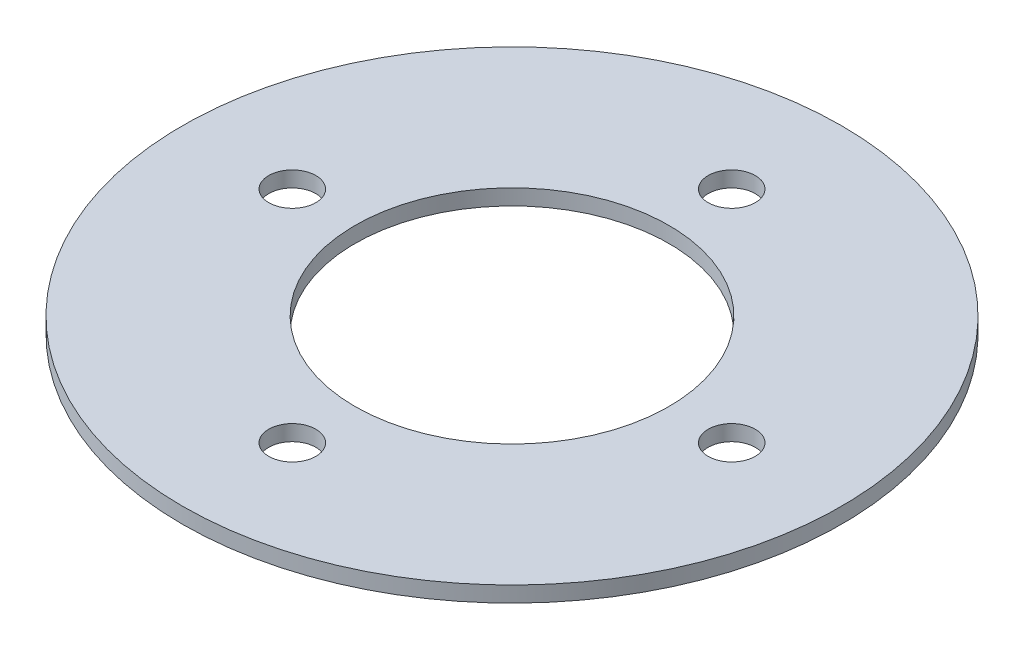
ISO-10303-21;
HEADER;
FILE_DESCRIPTION(('STEP AP214'),'2;1');
FILE_NAME('part.step','',(''),(''),'','','');
FILE_SCHEMA(('AUTOMOTIVE_DESIGN { 1 0 10303 214 1 1 1 1 }'));
ENDSEC;
DATA;
#1=APPLICATION_CONTEXT('core data for automotive mechanical design processes');
#2=APPLICATION_PROTOCOL_DEFINITION('international standard','automotive_design',2000,#1);
#3=PRODUCT_CONTEXT('',#1,'mechanical');
#4=PRODUCT('Part','Part','',(#3));
#5=PRODUCT_RELATED_PRODUCT_CATEGORY('part','',(#4));
#6=PRODUCT_DEFINITION_FORMATION('','',#4);
#7=PRODUCT_DEFINITION_CONTEXT('part definition',#1,'design');
#8=PRODUCT_DEFINITION('design','',#6,#7);
#9=PRODUCT_DEFINITION_SHAPE('','',#8);
#10=(LENGTH_UNIT() NAMED_UNIT(*) SI_UNIT(.MILLI.,.METRE.));
#11=(NAMED_UNIT(*) PLANE_ANGLE_UNIT() SI_UNIT($,.RADIAN.));
#12=(NAMED_UNIT(*) SI_UNIT($,.STERADIAN.) SOLID_ANGLE_UNIT());
#13=UNCERTAINTY_MEASURE_WITH_UNIT(LENGTH_MEASURE(1.E-05),#10,'distance_accuracy_value','');
#14=(GEOMETRIC_REPRESENTATION_CONTEXT(3) GLOBAL_UNCERTAINTY_ASSIGNED_CONTEXT((#13)) GLOBAL_UNIT_ASSIGNED_CONTEXT((#10,
#11,#12)) REPRESENTATION_CONTEXT('',''));
#15=CARTESIAN_POINT('',(0.,0.,0.));
#16=DIRECTION('',(0.,0.,1.));
#17=DIRECTION('',(1.,0.,0.));
#18=AXIS2_PLACEMENT_3D('',#15,#16,#17);
#19=CARTESIAN_POINT('',(0.,1.,0.));
#20=DIRECTION('',(0.,-1.,0.));
#21=DIRECTION('',(0.,0.,-1.));
#22=AXIS2_PLACEMENT_3D('',#19,#20,#21);
#23=CYLINDRICAL_SURFACE('',#22,10.);
#24=CARTESIAN_POINT('',(0.,1.,0.));
#25=DIRECTION('',(0.,1.,0.));
#26=DIRECTION('',(0.,0.,1.));
#27=AXIS2_PLACEMENT_3D('',#24,#25,#26);
#28=CIRCLE('',#27,10.);
#29=CARTESIAN_POINT('',(0.,1.,10.));
#30=VERTEX_POINT('',#29);
#31=EDGE_CURVE('E47',#30,#30,#28,.T.);
#32=ORIENTED_EDGE('',*,*,#31,.T.);
#33=EDGE_LOOP('',(#32));
#34=FACE_BOUND('',#33,.T.);
#35=CARTESIAN_POINT('',(0.,0.,0.));
#36=DIRECTION('',(0.,1.,0.));
#37=DIRECTION('',(0.,0.,1.));
#38=AXIS2_PLACEMENT_3D('',#35,#36,#37);
#39=CIRCLE('',#38,10.);
#40=CARTESIAN_POINT('',(0.,0.,10.));
#41=VERTEX_POINT('',#40);
#42=EDGE_CURVE('E68',#41,#41,#39,.T.);
#43=ORIENTED_EDGE('',*,*,#42,.F.);
#44=EDGE_LOOP('',(#43));
#45=FACE_BOUND('',#44,.T.);
#46=ADVANCED_FACE('F41',(#34,#45),#23,.F.);
#47=CARTESIAN_POINT('',(14.,1.,0.));
#48=DIRECTION('',(0.,-1.,0.));
#49=DIRECTION('',(0.,0.,-1.));
#50=AXIS2_PLACEMENT_3D('',#47,#48,#49);
#51=CYLINDRICAL_SURFACE('',#50,1.5);
#52=CARTESIAN_POINT('',(14.,1.,0.));
#53=DIRECTION('',(0.,1.,0.));
#54=DIRECTION('',(0.,0.,1.));
#55=AXIS2_PLACEMENT_3D('',#52,#53,#54);
#56=CIRCLE('',#55,1.5);
#57=CARTESIAN_POINT('',(14.,1.,1.5));
#58=VERTEX_POINT('',#57);
#59=EDGE_CURVE('E53',#58,#58,#56,.T.);
#60=ORIENTED_EDGE('',*,*,#59,.T.);
#61=EDGE_LOOP('',(#60));
#62=FACE_BOUND('',#61,.T.);
#63=CARTESIAN_POINT('',(14.,0.,0.));
#64=DIRECTION('',(0.,1.,0.));
#65=DIRECTION('',(0.,0.,1.));
#66=AXIS2_PLACEMENT_3D('',#63,#64,#65);
#67=CIRCLE('',#66,1.5);
#68=CARTESIAN_POINT('',(14.,0.,1.5));
#69=VERTEX_POINT('',#68);
#70=EDGE_CURVE('E70',#69,#69,#67,.T.);
#71=ORIENTED_EDGE('',*,*,#70,.F.);
#72=EDGE_LOOP('',(#71));
#73=FACE_BOUND('',#72,.T.);
#74=ADVANCED_FACE('F89',(#62,#73),#51,.F.);
#75=CARTESIAN_POINT('',(0.,1.,14.));
#76=DIRECTION('',(0.,-1.,0.));
#77=DIRECTION('',(0.,0.,-1.));
#78=AXIS2_PLACEMENT_3D('',#75,#76,#77);
#79=CYLINDRICAL_SURFACE('',#78,1.5);
#80=CARTESIAN_POINT('',(0.,1.,14.));
#81=DIRECTION('',(0.,1.,0.));
#82=DIRECTION('',(0.,0.,1.));
#83=AXIS2_PLACEMENT_3D('',#80,#81,#82);
#84=CIRCLE('',#83,1.5);
#85=CARTESIAN_POINT('',(0.,1.,15.5));
#86=VERTEX_POINT('',#85);
#87=EDGE_CURVE('E82',#86,#86,#84,.T.);
#88=ORIENTED_EDGE('',*,*,#87,.T.);
#89=EDGE_LOOP('',(#88));
#90=FACE_BOUND('',#89,.T.);
#91=CARTESIAN_POINT('',(0.,0.,14.));
#92=DIRECTION('',(0.,1.,0.));
#93=DIRECTION('',(0.,0.,1.));
#94=AXIS2_PLACEMENT_3D('',#91,#92,#93);
#95=CIRCLE('',#94,1.5);
#96=CARTESIAN_POINT('',(0.,0.,15.5));
#97=VERTEX_POINT('',#96);
#98=EDGE_CURVE('E63',#97,#97,#95,.T.);
#99=ORIENTED_EDGE('',*,*,#98,.F.);
#100=EDGE_LOOP('',(#99));
#101=FACE_BOUND('',#100,.T.);
#102=ADVANCED_FACE('F107',(#90,#101),#79,.F.);
#103=CARTESIAN_POINT('',(-14.,1.,0.));
#104=DIRECTION('',(0.,-1.,0.));
#105=DIRECTION('',(0.,0.,-1.));
#106=AXIS2_PLACEMENT_3D('',#103,#104,#105);
#107=CYLINDRICAL_SURFACE('',#106,1.5);
#108=CARTESIAN_POINT('',(-14.,1.,0.));
#109=DIRECTION('',(0.,1.,0.));
#110=DIRECTION('',(0.,0.,1.));
#111=AXIS2_PLACEMENT_3D('',#108,#109,#110);
#112=CIRCLE('',#111,1.5);
#113=CARTESIAN_POINT('',(-14.,1.,1.5));
#114=VERTEX_POINT('',#113);
#115=EDGE_CURVE('E79',#114,#114,#112,.T.);
#116=ORIENTED_EDGE('',*,*,#115,.T.);
#117=EDGE_LOOP('',(#116));
#118=FACE_BOUND('',#117,.T.);
#119=CARTESIAN_POINT('',(-14.,0.,0.));
#120=DIRECTION('',(0.,1.,0.));
#121=DIRECTION('',(0.,0.,1.));
#122=AXIS2_PLACEMENT_3D('',#119,#120,#121);
#123=CIRCLE('',#122,1.5);
#124=CARTESIAN_POINT('',(-14.,0.,1.5));
#125=VERTEX_POINT('',#124);
#126=EDGE_CURVE('E61',#125,#125,#123,.T.);
#127=ORIENTED_EDGE('',*,*,#126,.F.);
#128=EDGE_LOOP('',(#127));
#129=FACE_BOUND('',#128,.T.);
#130=ADVANCED_FACE('F111',(#118,#129),#107,.F.);
#131=CARTESIAN_POINT('',(0.,1.,-14.));
#132=DIRECTION('',(0.,-1.,0.));
#133=DIRECTION('',(0.,0.,-1.));
#134=AXIS2_PLACEMENT_3D('',#131,#132,#133);
#135=CYLINDRICAL_SURFACE('',#134,1.5);
#136=CARTESIAN_POINT('',(0.,1.,-14.));
#137=DIRECTION('',(0.,1.,0.));
#138=DIRECTION('',(0.,0.,1.));
#139=AXIS2_PLACEMENT_3D('',#136,#137,#138);
#140=CIRCLE('',#139,1.5);
#141=CARTESIAN_POINT('',(0.,1.,-12.5));
#142=VERTEX_POINT('',#141);
#143=EDGE_CURVE('E74',#142,#142,#140,.T.);
#144=ORIENTED_EDGE('',*,*,#143,.T.);
#145=EDGE_LOOP('',(#144));
#146=FACE_BOUND('',#145,.T.);
#147=CARTESIAN_POINT('',(0.,0.,-14.));
#148=DIRECTION('',(0.,1.,0.));
#149=DIRECTION('',(0.,0.,1.));
#150=AXIS2_PLACEMENT_3D('',#147,#148,#149);
#151=CIRCLE('',#150,1.5);
#152=CARTESIAN_POINT('',(0.,0.,-12.5));
#153=VERTEX_POINT('',#152);
#154=EDGE_CURVE('E59',#153,#153,#151,.T.);
#155=ORIENTED_EDGE('',*,*,#154,.F.);
#156=EDGE_LOOP('',(#155));
#157=FACE_BOUND('',#156,.T.);
#158=ADVANCED_FACE('F43',(#146,#157),#135,.F.);
#159=CARTESIAN_POINT('',(0.,1.,0.));
#160=DIRECTION('',(0.,-1.,0.));
#161=DIRECTION('',(0.,0.,-1.));
#162=AXIS2_PLACEMENT_3D('',#159,#160,#161);
#163=CYLINDRICAL_SURFACE('',#162,21.);
#164=CARTESIAN_POINT('',(0.,1.,0.));
#165=DIRECTION('',(0.,1.,0.));
#166=DIRECTION('',(0.,0.,1.));
#167=AXIS2_PLACEMENT_3D('',#164,#165,#166);
#168=CIRCLE('',#167,21.);
#169=CARTESIAN_POINT('',(0.,1.,21.));
#170=VERTEX_POINT('',#169);
#171=EDGE_CURVE('E10',#170,#170,#168,.T.);
#172=ORIENTED_EDGE('',*,*,#171,.F.);
#173=EDGE_LOOP('',(#172));
#174=FACE_BOUND('',#173,.T.);
#175=CARTESIAN_POINT('',(0.,0.,0.));
#176=DIRECTION('',(0.,1.,0.));
#177=DIRECTION('',(0.,0.,1.));
#178=AXIS2_PLACEMENT_3D('',#175,#176,#177);
#179=CIRCLE('',#178,21.);
#180=CARTESIAN_POINT('',(0.,0.,21.));
#181=VERTEX_POINT('',#180);
#182=EDGE_CURVE('E44',#181,#181,#179,.T.);
#183=ORIENTED_EDGE('',*,*,#182,.T.);
#184=EDGE_LOOP('',(#183));
#185=FACE_BOUND('',#184,.T.);
#186=ADVANCED_FACE('F100',(#174,#185),#163,.T.);
#187=CARTESIAN_POINT('',(0.,1.,0.));
#188=DIRECTION('',(0.,1.,0.));
#189=DIRECTION('',(0.,0.,1.));
#190=AXIS2_PLACEMENT_3D('',#187,#188,#189);
#191=PLANE('',#190);
#192=ORIENTED_EDGE('',*,*,#143,.F.);
#193=EDGE_LOOP('',(#192));
#194=FACE_BOUND('',#193,.T.);
#195=ORIENTED_EDGE('',*,*,#115,.F.);
#196=EDGE_LOOP('',(#195));
#197=FACE_BOUND('',#196,.T.);
#198=ORIENTED_EDGE('',*,*,#87,.F.);
#199=EDGE_LOOP('',(#198));
#200=FACE_BOUND('',#199,.T.);
#201=ORIENTED_EDGE('',*,*,#59,.F.);
#202=EDGE_LOOP('',(#201));
#203=FACE_BOUND('',#202,.T.);
#204=ORIENTED_EDGE('',*,*,#31,.F.);
#205=EDGE_LOOP('',(#204));
#206=FACE_BOUND('',#205,.T.);
#207=ORIENTED_EDGE('',*,*,#171,.T.);
#208=EDGE_LOOP('',(#207));
#209=FACE_BOUND('',#208,.T.);
#210=ADVANCED_FACE('F91',(#194,#197,#200,#203,#206,#209),#191,.T.);
#211=CARTESIAN_POINT('',(0.,0.,0.));
#212=DIRECTION('',(0.,1.,0.));
#213=DIRECTION('',(0.,0.,1.));
#214=AXIS2_PLACEMENT_3D('',#211,#212,#213);
#215=PLANE('',#214);
#216=ORIENTED_EDGE('',*,*,#154,.T.);
#217=EDGE_LOOP('',(#216));
#218=FACE_BOUND('',#217,.T.);
#219=ORIENTED_EDGE('',*,*,#126,.T.);
#220=EDGE_LOOP('',(#219));
#221=FACE_BOUND('',#220,.T.);
#222=ORIENTED_EDGE('',*,*,#98,.T.);
#223=EDGE_LOOP('',(#222));
#224=FACE_BOUND('',#223,.T.);
#225=ORIENTED_EDGE('',*,*,#70,.T.);
#226=EDGE_LOOP('',(#225));
#227=FACE_BOUND('',#226,.T.);
#228=ORIENTED_EDGE('',*,*,#42,.T.);
#229=EDGE_LOOP('',(#228));
#230=FACE_BOUND('',#229,.T.);
#231=ORIENTED_EDGE('',*,*,#182,.F.);
#232=EDGE_LOOP('',(#231));
#233=FACE_BOUND('',#232,.T.);
#234=ADVANCED_FACE('F96',(#218,#221,#224,#227,#230,#233),#215,.F.);
#235=CLOSED_SHELL('',(#46,#74,#102,#130,#158,#186,#210,#234));
#236=MANIFOLD_SOLID_BREP('B2',#235);
#237=ADVANCED_BREP_SHAPE_REPRESENTATION('',(#18,#236),#14);
#238=SHAPE_DEFINITION_REPRESENTATION(#9,#237);
ENDSEC;
END-ISO-10303-21;
